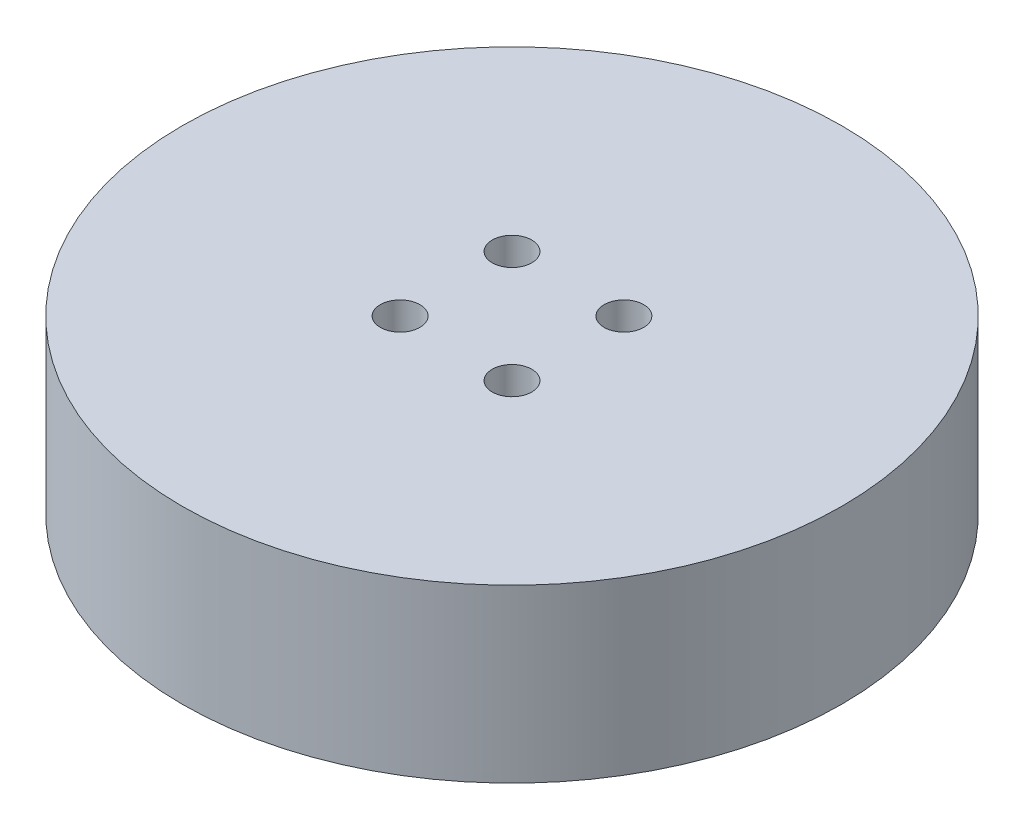
ISO-10303-21;
HEADER;
FILE_DESCRIPTION(('STEP AP214'),'2;1');
FILE_NAME('part.step','',(''),(''),'','','');
FILE_SCHEMA(('AUTOMOTIVE_DESIGN { 1 0 10303 214 1 1 1 1 }'));
ENDSEC;
DATA;
#1=APPLICATION_CONTEXT('core data for automotive mechanical design processes');
#2=APPLICATION_PROTOCOL_DEFINITION('international standard','automotive_design',2000,#1);
#3=PRODUCT_CONTEXT('',#1,'mechanical');
#4=PRODUCT('Part','Part','',(#3));
#5=PRODUCT_RELATED_PRODUCT_CATEGORY('part','',(#4));
#6=PRODUCT_DEFINITION_FORMATION('','',#4);
#7=PRODUCT_DEFINITION_CONTEXT('part definition',#1,'design');
#8=PRODUCT_DEFINITION('design','',#6,#7);
#9=PRODUCT_DEFINITION_SHAPE('','',#8);
#10=(LENGTH_UNIT() NAMED_UNIT(*) SI_UNIT(.MILLI.,.METRE.));
#11=(NAMED_UNIT(*) PLANE_ANGLE_UNIT() SI_UNIT($,.RADIAN.));
#12=(NAMED_UNIT(*) SI_UNIT($,.STERADIAN.) SOLID_ANGLE_UNIT());
#13=UNCERTAINTY_MEASURE_WITH_UNIT(LENGTH_MEASURE(1.E-05),#10,'distance_accuracy_value','');
#14=(GEOMETRIC_REPRESENTATION_CONTEXT(3) GLOBAL_UNCERTAINTY_ASSIGNED_CONTEXT((#13)) GLOBAL_UNIT_ASSIGNED_CONTEXT((#10,
#11,#12)) REPRESENTATION_CONTEXT('',''));
#15=CARTESIAN_POINT('',(0.,0.,0.));
#16=DIRECTION('',(0.,0.,1.));
#17=DIRECTION('',(1.,0.,0.));
#18=AXIS2_PLACEMENT_3D('',#15,#16,#17);
#19=CARTESIAN_POINT('',(0.,0.,25.));
#20=DIRECTION('',(0.,-1.,0.));
#21=DIRECTION('',(0.,0.,-1.));
#22=AXIS2_PLACEMENT_3D('',#19,#20,#21);
#23=PLANE('',#22);
#24=CARTESIAN_POINT('',(0.,0.,0.));
#25=DIRECTION('',(0.,-1.,0.));
#26=DIRECTION('',(0.,0.,-1.));
#27=AXIS2_PLACEMENT_3D('',#24,#25,#26);
#28=CIRCLE('',#27,12.5);
#29=CARTESIAN_POINT('',(0.,0.,-12.5));
#30=VERTEX_POINT('',#29);
#31=EDGE_CURVE('E12',#30,#30,#28,.T.);
#32=ORIENTED_EDGE('',*,*,#31,.F.);
#33=EDGE_LOOP('',(#32));
#34=FACE_BOUND('',#33,.T.);
#35=ADVANCED_FACE('F54',(#34),#23,.F.);
#36=CARTESIAN_POINT('',(0.,-2.,-8.));
#37=DIRECTION('',(0.,-1.,0.));
#38=DIRECTION('',(0.,0.,-1.));
#39=AXIS2_PLACEMENT_3D('',#36,#37,#38);
#40=PLANE('',#39);
#41=CARTESIAN_POINT('',(0.,-2.,-8.));
#42=DIRECTION('',(0.,-1.,0.));
#43=DIRECTION('',(0.,0.,-1.));
#44=AXIS2_PLACEMENT_3D('',#41,#42,#43);
#45=CIRCLE('',#44,1.5);
#46=CARTESIAN_POINT('',(0.,-2.,-9.5));
#47=VERTEX_POINT('',#46);
#48=EDGE_CURVE('E71',#47,#47,#45,.T.);
#49=ORIENTED_EDGE('',*,*,#48,.T.);
#50=EDGE_LOOP('',(#49));
#51=FACE_BOUND('',#50,.T.);
#52=ADVANCED_FACE('F125',(#51),#40,.T.);
#53=CARTESIAN_POINT('',(0.,-2.,8.));
#54=DIRECTION('',(0.,-1.,0.));
#55=DIRECTION('',(0.,0.,-1.));
#56=AXIS2_PLACEMENT_3D('',#53,#54,#55);
#57=PLANE('',#56);
#58=CARTESIAN_POINT('',(0.,-2.,8.));
#59=DIRECTION('',(0.,-1.,0.));
#60=DIRECTION('',(0.,0.,-1.));
#61=AXIS2_PLACEMENT_3D('',#58,#59,#60);
#62=CIRCLE('',#61,1.5);
#63=CARTESIAN_POINT('',(0.,-2.,6.5));
#64=VERTEX_POINT('',#63);
#65=EDGE_CURVE('E77',#64,#64,#62,.T.);
#66=ORIENTED_EDGE('',*,*,#65,.T.);
#67=EDGE_LOOP('',(#66));
#68=FACE_BOUND('',#67,.T.);
#69=ADVANCED_FACE('F133',(#68),#57,.T.);
#70=CARTESIAN_POINT('',(-9.5,-2.,0.));
#71=DIRECTION('',(0.,-1.,0.));
#72=DIRECTION('',(0.,0.,-1.));
#73=AXIS2_PLACEMENT_3D('',#70,#71,#72);
#74=PLANE('',#73);
#75=CARTESIAN_POINT('',(-9.5,-2.,0.));
#76=DIRECTION('',(0.,-1.,0.));
#77=DIRECTION('',(0.,0.,-1.));
#78=AXIS2_PLACEMENT_3D('',#75,#76,#77);
#79=CIRCLE('',#78,1.5);
#80=CARTESIAN_POINT('',(-9.5,-2.,-1.5));
#81=VERTEX_POINT('',#80);
#82=EDGE_CURVE('E83',#81,#81,#79,.T.);
#83=ORIENTED_EDGE('',*,*,#82,.T.);
#84=EDGE_LOOP('',(#83));
#85=FACE_BOUND('',#84,.T.);
#86=ADVANCED_FACE('F118',(#85),#74,.T.);
#87=CARTESIAN_POINT('',(9.5,-2.,0.));
#88=DIRECTION('',(0.,-1.,0.));
#89=DIRECTION('',(0.,0.,-1.));
#90=AXIS2_PLACEMENT_3D('',#87,#88,#89);
#91=PLANE('',#90);
#92=CARTESIAN_POINT('',(9.5,-2.,0.));
#93=DIRECTION('',(0.,-1.,0.));
#94=DIRECTION('',(0.,0.,-1.));
#95=AXIS2_PLACEMENT_3D('',#92,#93,#94);
#96=CIRCLE('',#95,1.5);
#97=CARTESIAN_POINT('',(9.5,-2.,-1.5));
#98=VERTEX_POINT('',#97);
#99=EDGE_CURVE('E64',#98,#98,#96,.T.);
#100=ORIENTED_EDGE('',*,*,#99,.T.);
#101=EDGE_LOOP('',(#100));
#102=FACE_BOUND('',#101,.T.);
#103=ADVANCED_FACE('F108',(#102),#91,.T.);
#104=CARTESIAN_POINT('',(0.,-2.,-8.));
#105=DIRECTION('',(0.,-1.,0.));
#106=DIRECTION('',(0.,0.,-1.));
#107=AXIS2_PLACEMENT_3D('',#104,#105,#106);
#108=CYLINDRICAL_SURFACE('',#107,1.5);
#109=ORIENTED_EDGE('',*,*,#48,.F.);
#110=EDGE_LOOP('',(#109));
#111=FACE_BOUND('',#110,.T.);
#112=CARTESIAN_POINT('',(0.,-7.,-8.));
#113=DIRECTION('',(0.,-1.,0.));
#114=DIRECTION('',(0.,0.,-1.));
#115=AXIS2_PLACEMENT_3D('',#112,#113,#114);
#116=CIRCLE('',#115,1.5);
#117=CARTESIAN_POINT('',(0.,-7.,-9.5));
#118=VERTEX_POINT('',#117);
#119=EDGE_CURVE('E74',#118,#118,#116,.T.);
#120=ORIENTED_EDGE('',*,*,#119,.T.);
#121=EDGE_LOOP('',(#120));
#122=FACE_BOUND('',#121,.T.);
#123=ADVANCED_FACE('F105',(#111,#122),#108,.F.);
#124=CARTESIAN_POINT('',(0.,-2.,8.));
#125=DIRECTION('',(0.,-1.,0.));
#126=DIRECTION('',(0.,0.,-1.));
#127=AXIS2_PLACEMENT_3D('',#124,#125,#126);
#128=CYLINDRICAL_SURFACE('',#127,1.5);
#129=ORIENTED_EDGE('',*,*,#65,.F.);
#130=EDGE_LOOP('',(#129));
#131=FACE_BOUND('',#130,.T.);
#132=CARTESIAN_POINT('',(0.,-7.,8.));
#133=DIRECTION('',(0.,-1.,0.));
#134=DIRECTION('',(0.,0.,-1.));
#135=AXIS2_PLACEMENT_3D('',#132,#133,#134);
#136=CIRCLE('',#135,1.5);
#137=CARTESIAN_POINT('',(0.,-7.,6.5));
#138=VERTEX_POINT('',#137);
#139=EDGE_CURVE('E80',#138,#138,#136,.T.);
#140=ORIENTED_EDGE('',*,*,#139,.T.);
#141=EDGE_LOOP('',(#140));
#142=FACE_BOUND('',#141,.T.);
#143=ADVANCED_FACE('F107',(#131,#142),#128,.F.);
#144=CARTESIAN_POINT('',(-9.5,-2.,0.));
#145=DIRECTION('',(0.,-1.,0.));
#146=DIRECTION('',(0.,0.,-1.));
#147=AXIS2_PLACEMENT_3D('',#144,#145,#146);
#148=CYLINDRICAL_SURFACE('',#147,1.5);
#149=ORIENTED_EDGE('',*,*,#82,.F.);
#150=EDGE_LOOP('',(#149));
#151=FACE_BOUND('',#150,.T.);
#152=CARTESIAN_POINT('',(-9.5,-7.,0.));
#153=DIRECTION('',(0.,-1.,0.));
#154=DIRECTION('',(0.,0.,-1.));
#155=AXIS2_PLACEMENT_3D('',#152,#153,#154);
#156=CIRCLE('',#155,1.5);
#157=CARTESIAN_POINT('',(-9.5,-7.,-1.5));
#158=VERTEX_POINT('',#157);
#159=EDGE_CURVE('E86',#158,#158,#156,.T.);
#160=ORIENTED_EDGE('',*,*,#159,.T.);
#161=EDGE_LOOP('',(#160));
#162=FACE_BOUND('',#161,.T.);
#163=ADVANCED_FACE('F114',(#151,#162),#148,.F.);
#164=CARTESIAN_POINT('',(9.5,-2.,0.));
#165=DIRECTION('',(0.,-1.,0.));
#166=DIRECTION('',(0.,0.,-1.));
#167=AXIS2_PLACEMENT_3D('',#164,#165,#166);
#168=CYLINDRICAL_SURFACE('',#167,1.5);
#169=ORIENTED_EDGE('',*,*,#99,.F.);
#170=EDGE_LOOP('',(#169));
#171=FACE_BOUND('',#170,.T.);
#172=CARTESIAN_POINT('',(9.5,-7.,0.));
#173=DIRECTION('',(0.,-1.,0.));
#174=DIRECTION('',(0.,0.,-1.));
#175=AXIS2_PLACEMENT_3D('',#172,#173,#174);
#176=CIRCLE('',#175,1.5);
#177=CARTESIAN_POINT('',(9.5,-7.,-1.5));
#178=VERTEX_POINT('',#177);
#179=EDGE_CURVE('E68',#178,#178,#176,.T.);
#180=ORIENTED_EDGE('',*,*,#179,.T.);
#181=EDGE_LOOP('',(#180));
#182=FACE_BOUND('',#181,.T.);
#183=ADVANCED_FACE('F92',(#171,#182),#168,.F.);
#184=CARTESIAN_POINT('',(0.,-7.,0.));
#185=DIRECTION('',(0.,-1.,0.));
#186=DIRECTION('',(0.,0.,-1.));
#187=AXIS2_PLACEMENT_3D('',#184,#185,#186);
#188=PLANE('',#187);
#189=ORIENTED_EDGE('',*,*,#179,.F.);
#190=EDGE_LOOP('',(#189));
#191=FACE_BOUND('',#190,.T.);
#192=ORIENTED_EDGE('',*,*,#159,.F.);
#193=EDGE_LOOP('',(#192));
#194=FACE_BOUND('',#193,.T.);
#195=ORIENTED_EDGE('',*,*,#139,.F.);
#196=EDGE_LOOP('',(#195));
#197=FACE_BOUND('',#196,.T.);
#198=ORIENTED_EDGE('',*,*,#119,.F.);
#199=EDGE_LOOP('',(#198));
#200=FACE_BOUND('',#199,.T.);
#201=CARTESIAN_POINT('',(0.,-7.,0.));
#202=DIRECTION('',(0.,-1.,0.));
#203=DIRECTION('',(0.,0.,-1.));
#204=AXIS2_PLACEMENT_3D('',#201,#202,#203);
#205=CIRCLE('',#204,12.5);
#206=CARTESIAN_POINT('',(0.,-7.,-12.5));
#207=VERTEX_POINT('',#206);
#208=EDGE_CURVE('E60',#207,#207,#205,.T.);
#209=ORIENTED_EDGE('',*,*,#208,.T.);
#210=EDGE_LOOP('',(#209));
#211=FACE_BOUND('',#210,.T.);
#212=ADVANCED_FACE('F94',(#191,#194,#197,#200,#211),#188,.T.);
#213=CARTESIAN_POINT('',(0.,-7.,0.));
#214=DIRECTION('',(0.,1.,0.));
#215=DIRECTION('',(0.,0.,1.));
#216=AXIS2_PLACEMENT_3D('',#213,#214,#215);
#217=CYLINDRICAL_SURFACE('',#216,12.5);
#218=ORIENTED_EDGE('',*,*,#208,.F.);
#219=EDGE_LOOP('',(#218));
#220=FACE_BOUND('',#219,.T.);
#221=ORIENTED_EDGE('',*,*,#31,.T.);
#222=EDGE_LOOP('',(#221));
#223=FACE_BOUND('',#222,.T.);
#224=ADVANCED_FACE('F97',(#220,#223),#217,.T.);
#225=CLOSED_SHELL('',(#35,#52,#69,#86,#103,#123,#143,#163,#183,#212,#224));
#226=MANIFOLD_SOLID_BREP('B2',#225);
#227=CARTESIAN_POINT('',(0.,0.,25.));
#228=DIRECTION('',(0.,-1.,0.));
#229=DIRECTION('',(0.,0.,-1.));
#230=AXIS2_PLACEMENT_3D('',#227,#228,#229);
#231=PLANE('',#230);
#232=CARTESIAN_POINT('',(0.,0.,0.));
#233=DIRECTION('',(0.,1.,0.));
#234=DIRECTION('',(0.,0.,1.));
#235=AXIS2_PLACEMENT_3D('',#232,#233,#234);
#236=CIRCLE('',#235,25.);
#237=CARTESIAN_POINT('',(0.,0.,-25.));
#238=VERTEX_POINT('',#237);
#239=EDGE_CURVE('E255',#238,#238,#236,.T.);
#240=ORIENTED_EDGE('',*,*,#239,.F.);
#241=EDGE_LOOP('',(#240));
#242=FACE_BOUND('',#241,.T.);
#243=ADVANCED_FACE('F213',(#242),#231,.T.);
#244=CARTESIAN_POINT('',(0.,13.,0.));
#245=DIRECTION('',(0.,-1.,0.));
#246=DIRECTION('',(0.,0.,-1.));
#247=AXIS2_PLACEMENT_3D('',#244,#245,#246);
#248=CYLINDRICAL_SURFACE('',#247,25.);
#249=CARTESIAN_POINT('',(0.,13.,0.));
#250=DIRECTION('',(0.,1.,0.));
#251=DIRECTION('',(0.,0.,1.));
#252=AXIS2_PLACEMENT_3D('',#249,#250,#251);
#253=CIRCLE('',#252,25.);
#254=CARTESIAN_POINT('',(0.,13.,-25.));
#255=VERTEX_POINT('',#254);
#256=EDGE_CURVE('E257',#255,#255,#253,.T.);
#257=CARTESIAN_POINT('',(0.,13.,-25.));
#258=CARTESIAN_POINT('',(0.,12.8645833333333,-25.));
#259=CARTESIAN_POINT('',(0.,12.7291666666667,-25.));
#260=CARTESIAN_POINT('',(0.,12.4583333333333,-25.));
#261=CARTESIAN_POINT('',(0.,12.3229166666667,-25.));
#262=CARTESIAN_POINT('',(0.,12.0520833333333,-25.));
#263=CARTESIAN_POINT('',(0.,11.9166666666667,-25.));
#264=CARTESIAN_POINT('',(0.,11.6458333333333,-25.));
#265=CARTESIAN_POINT('',(0.,11.5104166666667,-25.));
#266=CARTESIAN_POINT('',(0.,11.2395833333333,-25.));
#267=CARTESIAN_POINT('',(0.,11.1041666666667,-25.));
#268=CARTESIAN_POINT('',(0.,10.8333333333333,-25.));
#269=CARTESIAN_POINT('',(0.,10.6979166666667,-25.));
#270=CARTESIAN_POINT('',(0.,10.4270833333333,-25.));
#271=CARTESIAN_POINT('',(0.,10.2916666666667,-25.));
#272=CARTESIAN_POINT('',(0.,10.0208333333333,-25.));
#273=CARTESIAN_POINT('',(0.,9.88541666666667,-25.));
#274=CARTESIAN_POINT('',(0.,9.61458333333333,-25.));
#275=CARTESIAN_POINT('',(0.,9.47916666666667,-25.));
#276=CARTESIAN_POINT('',(0.,9.20833333333333,-25.));
#277=CARTESIAN_POINT('',(0.,9.07291666666667,-25.));
#278=CARTESIAN_POINT('',(0.,8.80208333333333,-25.));
#279=CARTESIAN_POINT('',(0.,8.66666666666667,-25.));
#280=CARTESIAN_POINT('',(0.,8.39583333333333,-25.));
#281=CARTESIAN_POINT('',(0.,8.26041666666667,-25.));
#282=CARTESIAN_POINT('',(0.,7.98958333333333,-25.));
#283=CARTESIAN_POINT('',(0.,7.85416666666667,-25.));
#284=CARTESIAN_POINT('',(0.,7.58333333333333,-25.));
#285=CARTESIAN_POINT('',(0.,7.44791666666667,-25.));
#286=CARTESIAN_POINT('',(0.,7.17708333333333,-25.));
#287=CARTESIAN_POINT('',(0.,7.04166666666667,-25.));
#288=CARTESIAN_POINT('',(0.,6.77083333333333,-25.));
#289=CARTESIAN_POINT('',(0.,6.63541666666667,-25.));
#290=CARTESIAN_POINT('',(0.,6.36458333333333,-25.));
#291=CARTESIAN_POINT('',(0.,6.22916666666667,-25.));
#292=CARTESIAN_POINT('',(0.,5.95833333333333,-25.));
#293=CARTESIAN_POINT('',(0.,5.82291666666667,-25.));
#294=CARTESIAN_POINT('',(0.,5.55208333333333,-25.));
#295=CARTESIAN_POINT('',(0.,5.41666666666667,-25.));
#296=CARTESIAN_POINT('',(0.,5.14583333333333,-25.));
#297=CARTESIAN_POINT('',(0.,5.01041666666667,-25.));
#298=CARTESIAN_POINT('',(0.,4.73958333333333,-25.));
#299=CARTESIAN_POINT('',(0.,4.60416666666667,-25.));
#300=CARTESIAN_POINT('',(0.,4.33333333333333,-25.));
#301=CARTESIAN_POINT('',(0.,4.19791666666667,-25.));
#302=CARTESIAN_POINT('',(0.,3.92708333333333,-25.));
#303=CARTESIAN_POINT('',(0.,3.79166666666667,-25.));
#304=CARTESIAN_POINT('',(0.,3.52083333333333,-25.));
#305=CARTESIAN_POINT('',(0.,3.38541666666667,-25.));
#306=CARTESIAN_POINT('',(0.,3.11458333333333,-25.));
#307=CARTESIAN_POINT('',(0.,2.97916666666667,-25.));
#308=CARTESIAN_POINT('',(0.,2.70833333333333,-25.));
#309=CARTESIAN_POINT('',(0.,2.57291666666667,-25.));
#310=CARTESIAN_POINT('',(0.,2.30208333333333,-25.));
#311=CARTESIAN_POINT('',(0.,2.16666666666667,-25.));
#312=CARTESIAN_POINT('',(0.,1.89583333333333,-25.));
#313=CARTESIAN_POINT('',(0.,1.76041666666667,-25.));
#314=CARTESIAN_POINT('',(0.,1.48958333333333,-25.));
#315=CARTESIAN_POINT('',(0.,1.35416666666667,-25.));
#316=CARTESIAN_POINT('',(0.,1.08333333333333,-25.));
#317=CARTESIAN_POINT('',(0.,0.947916666666667,-25.));
#318=CARTESIAN_POINT('',(0.,0.677083333333334,-25.));
#319=CARTESIAN_POINT('',(0.,0.541666666666667,-25.));
#320=CARTESIAN_POINT('',(0.,0.270833333333334,-25.));
#321=CARTESIAN_POINT('',(0.,0.135416666666667,-25.));
#322=CARTESIAN_POINT('',(0.,0.,-25.));
#323=B_SPLINE_CURVE_WITH_KNOTS('',3,(#257,#258,#259,#260,#261,#262,#263,#264,#265,#266,#267,
#268,#269,#270,#271,#272,#273,#274,#275,#276,#277,#278,#279,#280,#281,#282,#283,#284,#285,#286,
#287,#288,#289,#290,#291,#292,#293,#294,#295,#296,#297,#298,#299,#300,#301,#302,#303,#304,#305,
#306,#307,#308,#309,#310,#311,#312,#313,#314,#315,#316,#317,#318,#319,#320,#321,#322),
.UNSPECIFIED.,.F.,.F.,(4,2,2,2,2,2,2,2,2,2,2,2,2,2,2,2,2,2,2,2,2,2,2,2,2,2,2,2,2,2,2,2,4),(0.,
0.406249999999999,0.812499999999999,1.21875,1.625,2.03125,2.4375,2.84375,3.25,3.65625,4.0625,
4.46875,4.875,5.28125,5.6875,6.09375,6.5,6.90625,7.3125,7.71875,8.125,8.53125,8.9375,9.34375,
9.75,10.15625,10.5625,10.96875,11.375,11.78125,12.1875,12.59375,13.),.UNSPECIFIED.);
#324=EDGE_CURVE('BSEAM265',#255,#238,#323,.T.);
#325=ORIENTED_EDGE('',*,*,#256,.F.);
#326=ORIENTED_EDGE('',*,*,#239,.T.);
#327=ORIENTED_EDGE('',*,*,#324,.T.);
#328=ORIENTED_EDGE('',*,*,#324,.F.);
#329=EDGE_LOOP('',(#325,#327,#326,#328));
#330=FACE_BOUND('',#329,.T.);
#331=ADVANCED_FACE('F265',(#330),#248,.T.);
#332=CARTESIAN_POINT('',(0.,13.,0.));
#333=DIRECTION('',(0.,1.,0.));
#334=DIRECTION('',(0.,0.,1.));
#335=AXIS2_PLACEMENT_3D('',#332,#333,#334);
#336=PLANE('',#335);
#337=CARTESIAN_POINT('',(-4.24264068711929,13.,4.24264068711928));
#338=DIRECTION('',(0.,1.,0.));
#339=DIRECTION('',(0.,0.,1.));
#340=AXIS2_PLACEMENT_3D('',#337,#338,#339);
#341=CIRCLE('',#340,1.5);
#342=CARTESIAN_POINT('',(-4.24264068711929,13.,5.74264068711928));
#343=VERTEX_POINT('',#342);
#344=EDGE_CURVE('E221',#343,#343,#341,.T.);
#345=ORIENTED_EDGE('',*,*,#344,.F.);
#346=EDGE_LOOP('',(#345));
#347=FACE_BOUND('',#346,.T.);
#348=CARTESIAN_POINT('',(4.24264068711929,13.,4.24264068711928));
#349=DIRECTION('',(0.,1.,0.));
#350=DIRECTION('',(0.,0.,1.));
#351=AXIS2_PLACEMENT_3D('',#348,#349,#350);
#352=CIRCLE('',#351,1.5);
#353=CARTESIAN_POINT('',(4.24264068711929,13.,5.74264068711928));
#354=VERTEX_POINT('',#353);
#355=EDGE_CURVE('E236',#354,#354,#352,.T.);
#356=ORIENTED_EDGE('',*,*,#355,.F.);
#357=EDGE_LOOP('',(#356));
#358=FACE_BOUND('',#357,.T.);
#359=CARTESIAN_POINT('',(4.24264068711929,13.,-4.24264068711929));
#360=DIRECTION('',(0.,1.,0.));
#361=DIRECTION('',(0.,0.,1.));
#362=AXIS2_PLACEMENT_3D('',#359,#360,#361);
#363=CIRCLE('',#362,1.5);
#364=CARTESIAN_POINT('',(4.24264068711929,13.,-2.74264068711929));
#365=VERTEX_POINT('',#364);
#366=EDGE_CURVE('E216',#365,#365,#363,.T.);
#367=ORIENTED_EDGE('',*,*,#366,.F.);
#368=EDGE_LOOP('',(#367));
#369=FACE_BOUND('',#368,.T.);
#370=CARTESIAN_POINT('',(-4.24264068711929,13.,-4.24264068711929));
#371=DIRECTION('',(0.,1.,0.));
#372=DIRECTION('',(0.,0.,1.));
#373=AXIS2_PLACEMENT_3D('',#370,#371,#372);
#374=CIRCLE('',#373,1.5);
#375=CARTESIAN_POINT('',(-4.24264068711929,13.,-2.74264068711929));
#376=VERTEX_POINT('',#375);
#377=EDGE_CURVE('E246',#376,#376,#374,.T.);
#378=ORIENTED_EDGE('',*,*,#377,.F.);
#379=EDGE_LOOP('',(#378));
#380=FACE_BOUND('',#379,.T.);
#381=ORIENTED_EDGE('',*,*,#256,.T.);
#382=EDGE_LOOP('',(#381));
#383=FACE_BOUND('',#382,.T.);
#384=ADVANCED_FACE('F273',(#347,#358,#369,#380,#383),#336,.T.);
#385=CARTESIAN_POINT('',(-4.24264068711929,3.,-4.24264068711929));
#386=DIRECTION('',(0.,1.,0.));
#387=DIRECTION('',(0.,0.,1.));
#388=AXIS2_PLACEMENT_3D('',#385,#386,#387);
#389=CYLINDRICAL_SURFACE('',#388,1.5);
#390=CARTESIAN_POINT('',(-4.24264068711929,3.,-4.24264068711929));
#391=DIRECTION('',(0.,1.,0.));
#392=DIRECTION('',(0.,0.,1.));
#393=AXIS2_PLACEMENT_3D('',#390,#391,#392);
#394=CIRCLE('',#393,1.5);
#395=CARTESIAN_POINT('',(-4.24264068711929,3.,-2.74264068711929));
#396=VERTEX_POINT('',#395);
#397=EDGE_CURVE('E230',#396,#396,#394,.T.);
#398=ORIENTED_EDGE('',*,*,#397,.F.);
#399=EDGE_LOOP('',(#398));
#400=FACE_BOUND('',#399,.T.);
#401=ORIENTED_EDGE('',*,*,#377,.T.);
#402=EDGE_LOOP('',(#401));
#403=FACE_BOUND('',#402,.T.);
#404=ADVANCED_FACE('F306',(#400,#403),#389,.F.);
#405=CARTESIAN_POINT('',(-4.24264068711929,3.,-4.24264068711929));
#406=DIRECTION('',(0.,1.,0.));
#407=DIRECTION('',(0.,0.,1.));
#408=AXIS2_PLACEMENT_3D('',#405,#406,#407);
#409=PLANE('',#408);
#410=ORIENTED_EDGE('',*,*,#397,.T.);
#411=EDGE_LOOP('',(#410));
#412=FACE_BOUND('',#411,.T.);
#413=ADVANCED_FACE('F287',(#412),#409,.T.);
#414=CARTESIAN_POINT('',(4.24264068711929,3.,-4.24264068711929));
#415=DIRECTION('',(0.,1.,0.));
#416=DIRECTION('',(0.,0.,1.));
#417=AXIS2_PLACEMENT_3D('',#414,#415,#416);
#418=CYLINDRICAL_SURFACE('',#417,1.5);
#419=CARTESIAN_POINT('',(4.24264068711929,3.,-4.24264068711929));
#420=DIRECTION('',(0.,1.,0.));
#421=DIRECTION('',(0.,0.,1.));
#422=AXIS2_PLACEMENT_3D('',#419,#420,#421);
#423=CIRCLE('',#422,1.5);
#424=CARTESIAN_POINT('',(4.24264068711929,3.,-2.74264068711929));
#425=VERTEX_POINT('',#424);
#426=EDGE_CURVE('E239',#425,#425,#423,.T.);
#427=ORIENTED_EDGE('',*,*,#426,.F.);
#428=EDGE_LOOP('',(#427));
#429=FACE_BOUND('',#428,.T.);
#430=ORIENTED_EDGE('',*,*,#366,.T.);
#431=EDGE_LOOP('',(#430));
#432=FACE_BOUND('',#431,.T.);
#433=ADVANCED_FACE('F299',(#429,#432),#418,.F.);
#434=CARTESIAN_POINT('',(4.24264068711929,3.,-4.24264068711929));
#435=DIRECTION('',(0.,1.,0.));
#436=DIRECTION('',(0.,0.,1.));
#437=AXIS2_PLACEMENT_3D('',#434,#435,#436);
#438=PLANE('',#437);
#439=ORIENTED_EDGE('',*,*,#426,.T.);
#440=EDGE_LOOP('',(#439));
#441=FACE_BOUND('',#440,.T.);
#442=ADVANCED_FACE('F296',(#441),#438,.T.);
#443=CARTESIAN_POINT('',(4.24264068711929,3.,4.24264068711928));
#444=DIRECTION('',(0.,1.,0.));
#445=DIRECTION('',(0.,0.,1.));
#446=AXIS2_PLACEMENT_3D('',#443,#444,#445);
#447=CYLINDRICAL_SURFACE('',#446,1.5);
#448=CARTESIAN_POINT('',(4.24264068711929,3.,4.24264068711928));
#449=DIRECTION('',(0.,1.,0.));
#450=DIRECTION('',(0.,0.,1.));
#451=AXIS2_PLACEMENT_3D('',#448,#449,#450);
#452=CIRCLE('',#451,1.5);
#453=CARTESIAN_POINT('',(4.24264068711929,3.,5.74264068711928));
#454=VERTEX_POINT('',#453);
#455=EDGE_CURVE('E227',#454,#454,#452,.T.);
#456=ORIENTED_EDGE('',*,*,#455,.F.);
#457=EDGE_LOOP('',(#456));
#458=FACE_BOUND('',#457,.T.);
#459=ORIENTED_EDGE('',*,*,#355,.T.);
#460=EDGE_LOOP('',(#459));
#461=FACE_BOUND('',#460,.T.);
#462=ADVANCED_FACE('F292',(#458,#461),#447,.F.);
#463=CARTESIAN_POINT('',(4.24264068711929,3.,4.24264068711928));
#464=DIRECTION('',(0.,1.,0.));
#465=DIRECTION('',(0.,0.,1.));
#466=AXIS2_PLACEMENT_3D('',#463,#464,#465);
#467=PLANE('',#466);
#468=ORIENTED_EDGE('',*,*,#455,.T.);
#469=EDGE_LOOP('',(#468));
#470=FACE_BOUND('',#469,.T.);
#471=ADVANCED_FACE('F283',(#470),#467,.T.);
#472=CARTESIAN_POINT('',(-4.24264068711929,3.,4.24264068711928));
#473=DIRECTION('',(0.,1.,0.));
#474=DIRECTION('',(0.,0.,1.));
#475=AXIS2_PLACEMENT_3D('',#472,#473,#474);
#476=CYLINDRICAL_SURFACE('',#475,1.5);
#477=CARTESIAN_POINT('',(-4.24264068711929,3.,4.24264068711928));
#478=DIRECTION('',(0.,1.,0.));
#479=DIRECTION('',(0.,0.,1.));
#480=AXIS2_PLACEMENT_3D('',#477,#478,#479);
#481=CIRCLE('',#480,1.5);
#482=CARTESIAN_POINT('',(-4.24264068711929,3.,5.74264068711928));
#483=VERTEX_POINT('',#482);
#484=EDGE_CURVE('E53',#483,#483,#481,.T.);
#485=ORIENTED_EDGE('',*,*,#484,.F.);
#486=EDGE_LOOP('',(#485));
#487=FACE_BOUND('',#486,.T.);
#488=ORIENTED_EDGE('',*,*,#344,.T.);
#489=EDGE_LOOP('',(#488));
#490=FACE_BOUND('',#489,.T.);
#491=ADVANCED_FACE('F277',(#487,#490),#476,.F.);
#492=CARTESIAN_POINT('',(-4.24264068711929,3.,4.24264068711928));
#493=DIRECTION('',(0.,1.,0.));
#494=DIRECTION('',(0.,0.,1.));
#495=AXIS2_PLACEMENT_3D('',#492,#493,#494);
#496=PLANE('',#495);
#497=ORIENTED_EDGE('',*,*,#484,.T.);
#498=EDGE_LOOP('',(#497));
#499=FACE_BOUND('',#498,.T.);
#500=ADVANCED_FACE('F268',(#499),#496,.T.);
#501=CLOSED_SHELL('',(#243,#331,#384,#404,#413,#433,#442,#462,#471,#491,#500));
#502=MANIFOLD_SOLID_BREP('B7',#501);
#503=ADVANCED_BREP_SHAPE_REPRESENTATION('',(#18,#226,#502),#14);
#504=SHAPE_DEFINITION_REPRESENTATION(#9,#503);
ENDSEC;
END-ISO-10303-21;
